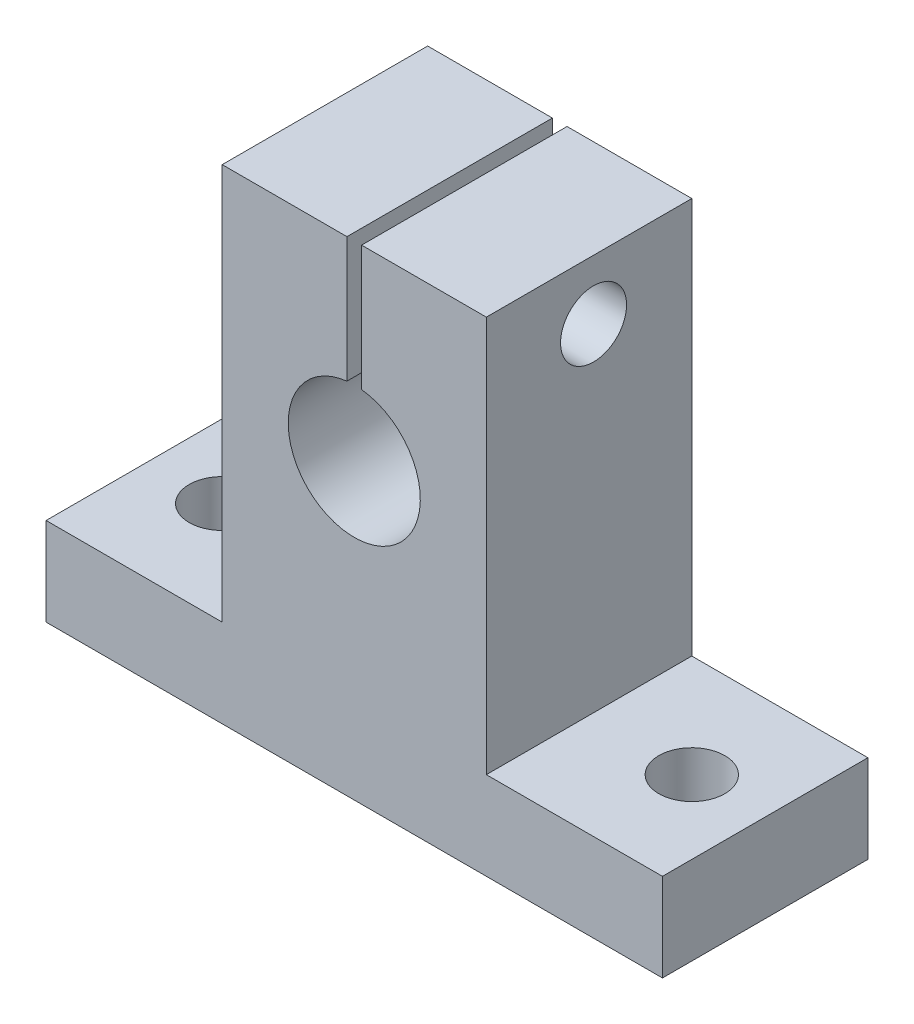
ISO-10303-21;
HEADER;
FILE_DESCRIPTION(('STEP AP214'),'2;1');
FILE_NAME('part.step','',(''),(''),'','','');
FILE_SCHEMA(('AUTOMOTIVE_DESIGN { 1 0 10303 214 1 1 1 1 }'));
ENDSEC;
DATA;
#1=APPLICATION_CONTEXT('core data for automotive mechanical design processes');
#2=APPLICATION_PROTOCOL_DEFINITION('international standard','automotive_design',2000,#1);
#3=PRODUCT_CONTEXT('',#1,'mechanical');
#4=PRODUCT('Part','Part','',(#3));
#5=PRODUCT_RELATED_PRODUCT_CATEGORY('part','',(#4));
#6=PRODUCT_DEFINITION_FORMATION('','',#4);
#7=PRODUCT_DEFINITION_CONTEXT('part definition',#1,'design');
#8=PRODUCT_DEFINITION('design','',#6,#7);
#9=PRODUCT_DEFINITION_SHAPE('','',#8);
#10=(LENGTH_UNIT() NAMED_UNIT(*) SI_UNIT(.MILLI.,.METRE.));
#11=(NAMED_UNIT(*) PLANE_ANGLE_UNIT() SI_UNIT($,.RADIAN.));
#12=(NAMED_UNIT(*) SI_UNIT($,.STERADIAN.) SOLID_ANGLE_UNIT());
#13=UNCERTAINTY_MEASURE_WITH_UNIT(LENGTH_MEASURE(1.E-05),#10,'distance_accuracy_value','');
#14=(GEOMETRIC_REPRESENTATION_CONTEXT(3) GLOBAL_UNCERTAINTY_ASSIGNED_CONTEXT((#13)) GLOBAL_UNIT_ASSIGNED_CONTEXT((#10,
#11,#12)) REPRESENTATION_CONTEXT('',''));
#15=CARTESIAN_POINT('',(0.,0.,0.));
#16=DIRECTION('',(0.,0.,1.));
#17=DIRECTION('',(1.,0.,0.));
#18=AXIS2_PLACEMENT_3D('',#15,#16,#17);
#19=CARTESIAN_POINT('',(0.,30.,14.));
#20=DIRECTION('',(0.,1.,0.));
#21=DIRECTION('',(0.,0.,1.));
#22=AXIS2_PLACEMENT_3D('',#19,#20,#21);
#23=PLANE('',#22);
#24=DIRECTION('',(0.,0.,1.));
#25=VECTOR('',#24,1.);
#26=CARTESIAN_POINT('',(0.5,30.,0.));
#27=LINE('',#26,#25);
#28=CARTESIAN_POINT('',(0.500000000000001,30.,0.));
#29=VERTEX_POINT('',#28);
#30=CARTESIAN_POINT('',(0.5,30.,14.));
#31=VERTEX_POINT('',#30);
#32=EDGE_CURVE('E59',#29,#31,#27,.T.);
#33=ORIENTED_EDGE('',*,*,#32,.T.);
#34=DIRECTION('',(1.,0.,0.));
#35=VECTOR('',#34,1.);
#36=CARTESIAN_POINT('',(0.,30.,14.));
#37=LINE('',#36,#35);
#38=CARTESIAN_POINT('',(9.,30.,14.));
#39=VERTEX_POINT('',#38);
#40=EDGE_CURVE('E299',#31,#39,#37,.T.);
#41=ORIENTED_EDGE('',*,*,#40,.T.);
#42=DIRECTION('',(0.,0.,-1.));
#43=VECTOR('',#42,1.);
#44=CARTESIAN_POINT('',(9.,30.,14.));
#45=LINE('',#44,#43);
#46=CARTESIAN_POINT('',(9.,30.,0.));
#47=VERTEX_POINT('',#46);
#48=EDGE_CURVE('E172',#39,#47,#45,.T.);
#49=ORIENTED_EDGE('',*,*,#48,.T.);
#50=DIRECTION('',(1.,0.,0.));
#51=VECTOR('',#50,1.);
#52=CARTESIAN_POINT('',(0.,30.,0.));
#53=LINE('',#52,#51);
#54=EDGE_CURVE('E158',#29,#47,#53,.T.);
#55=ORIENTED_EDGE('',*,*,#54,.F.);
#56=EDGE_LOOP('',(#33,#41,#49,#55));
#57=FACE_BOUND('',#56,.T.);
#58=ADVANCED_FACE('F42',(#57),#23,.T.);
#59=CARTESIAN_POINT('',(-9.,0.,14.));
#60=DIRECTION('',(-1.,0.,0.));
#61=DIRECTION('',(0.,0.,1.));
#62=AXIS2_PLACEMENT_3D('',#59,#60,#61);
#63=PLANE('',#62);
#64=CARTESIAN_POINT('',(-9.,25.95,6.69529201392618));
#65=DIRECTION('',(-1.,0.,0.));
#66=DIRECTION('',(0.,0.,1.));
#67=AXIS2_PLACEMENT_3D('',#64,#65,#66);
#68=CIRCLE('',#67,2.25);
#69=CARTESIAN_POINT('',(-9.,25.95,8.94529201392619));
#70=VERTEX_POINT('',#69);
#71=EDGE_CURVE('E338',#70,#70,#68,.F.);
#72=ORIENTED_EDGE('',*,*,#71,.T.);
#73=EDGE_LOOP('',(#72));
#74=FACE_BOUND('',#73,.T.);
#75=DIRECTION('',(0.,1.,0.));
#76=VECTOR('',#75,1.);
#77=CARTESIAN_POINT('',(-9.,0.,0.));
#78=LINE('',#77,#76);
#79=CARTESIAN_POINT('',(-9.,3.,0.));
#80=VERTEX_POINT('',#79);
#81=CARTESIAN_POINT('',(-9.,30.,0.));
#82=VERTEX_POINT('',#81);
#83=EDGE_CURVE('E155',#80,#82,#78,.T.);
#84=ORIENTED_EDGE('',*,*,#83,.F.);
#85=DIRECTION('',(0.,0.,-1.));
#86=VECTOR('',#85,1.);
#87=CARTESIAN_POINT('',(-9.,3.,14.));
#88=LINE('',#87,#86);
#89=CARTESIAN_POINT('',(-9.,3.,14.));
#90=VERTEX_POINT('',#89);
#91=EDGE_CURVE('E11',#90,#80,#88,.T.);
#92=ORIENTED_EDGE('',*,*,#91,.F.);
#93=DIRECTION('',(0.,1.,0.));
#94=VECTOR('',#93,1.);
#95=CARTESIAN_POINT('',(-9.,0.,14.));
#96=LINE('',#95,#94);
#97=CARTESIAN_POINT('',(-9.,30.,14.));
#98=VERTEX_POINT('',#97);
#99=EDGE_CURVE('E163',#90,#98,#96,.T.);
#100=ORIENTED_EDGE('',*,*,#99,.T.);
#101=DIRECTION('',(0.,0.,-1.));
#102=VECTOR('',#101,1.);
#103=CARTESIAN_POINT('',(-9.,30.,14.));
#104=LINE('',#103,#102);
#105=EDGE_CURVE('E169',#98,#82,#104,.T.);
#106=ORIENTED_EDGE('',*,*,#105,.T.);
#107=EDGE_LOOP('',(#84,#92,#100,#106));
#108=FACE_BOUND('',#107,.T.);
#109=ADVANCED_FACE('F263',(#74,#108),#63,.T.);
#110=CARTESIAN_POINT('',(0.,3.,14.));
#111=DIRECTION('',(0.,1.,0.));
#112=DIRECTION('',(0.,0.,1.));
#113=AXIS2_PLACEMENT_3D('',#110,#111,#112);
#114=PLANE('',#113);
#115=CARTESIAN_POINT('',(-16.,3.,7.));
#116=DIRECTION('',(0.,1.,0.));
#117=DIRECTION('',(0.,0.,1.));
#118=AXIS2_PLACEMENT_3D('',#115,#116,#117);
#119=CIRCLE('',#118,2.25);
#120=CARTESIAN_POINT('',(-16.,3.,9.25));
#121=VERTEX_POINT('',#120);
#122=EDGE_CURVE('E312',#121,#121,#119,.T.);
#123=ORIENTED_EDGE('',*,*,#122,.F.);
#124=EDGE_LOOP('',(#123));
#125=FACE_BOUND('',#124,.T.);
#126=DIRECTION('',(1.,0.,0.));
#127=VECTOR('',#126,1.);
#128=CARTESIAN_POINT('',(0.,3.,0.));
#129=LINE('',#128,#127);
#130=CARTESIAN_POINT('',(-21.,3.,0.));
#131=VERTEX_POINT('',#130);
#132=EDGE_CURVE('E202',#131,#80,#129,.T.);
#133=ORIENTED_EDGE('',*,*,#132,.F.);
#134=DIRECTION('',(0.,0.,-1.));
#135=VECTOR('',#134,1.);
#136=CARTESIAN_POINT('',(-21.,3.,14.));
#137=LINE('',#136,#135);
#138=CARTESIAN_POINT('',(-21.,3.,14.));
#139=VERTEX_POINT('',#138);
#140=EDGE_CURVE('E52',#139,#131,#137,.T.);
#141=ORIENTED_EDGE('',*,*,#140,.F.);
#142=DIRECTION('',(1.,0.,0.));
#143=VECTOR('',#142,1.);
#144=CARTESIAN_POINT('',(0.,3.,14.));
#145=LINE('',#144,#143);
#146=EDGE_CURVE('E306',#139,#90,#145,.T.);
#147=ORIENTED_EDGE('',*,*,#146,.T.);
#148=ORIENTED_EDGE('',*,*,#91,.T.);
#149=EDGE_LOOP('',(#133,#141,#147,#148));
#150=FACE_BOUND('',#149,.T.);
#151=ADVANCED_FACE('F203',(#125,#150),#114,.T.);
#152=CARTESIAN_POINT('',(-21.,0.,14.));
#153=DIRECTION('',(-1.,0.,0.));
#154=DIRECTION('',(0.,0.,1.));
#155=AXIS2_PLACEMENT_3D('',#152,#153,#154);
#156=PLANE('',#155);
#157=DIRECTION('',(0.,1.,0.));
#158=VECTOR('',#157,1.);
#159=CARTESIAN_POINT('',(-21.,0.,0.));
#160=LINE('',#159,#158);
#161=CARTESIAN_POINT('',(-21.,-3.,0.));
#162=VERTEX_POINT('',#161);
#163=EDGE_CURVE('E196',#162,#131,#160,.T.);
#164=ORIENTED_EDGE('',*,*,#163,.F.);
#165=DIRECTION('',(0.,0.,-1.));
#166=VECTOR('',#165,1.);
#167=CARTESIAN_POINT('',(-21.,-3.,14.));
#168=LINE('',#167,#166);
#169=CARTESIAN_POINT('',(-21.,-3.,14.));
#170=VERTEX_POINT('',#169);
#171=EDGE_CURVE('E186',#170,#162,#168,.T.);
#172=ORIENTED_EDGE('',*,*,#171,.F.);
#173=DIRECTION('',(0.,1.,0.));
#174=VECTOR('',#173,1.);
#175=CARTESIAN_POINT('',(-21.,0.,14.));
#176=LINE('',#175,#174);
#177=EDGE_CURVE('E198',#170,#139,#176,.T.);
#178=ORIENTED_EDGE('',*,*,#177,.T.);
#179=ORIENTED_EDGE('',*,*,#140,.T.);
#180=EDGE_LOOP('',(#164,#172,#178,#179));
#181=FACE_BOUND('',#180,.T.);
#182=ADVANCED_FACE('F194',(#181),#156,.T.);
#183=CARTESIAN_POINT('',(0.,-3.,14.));
#184=DIRECTION('',(0.,1.,0.));
#185=DIRECTION('',(0.,0.,1.));
#186=AXIS2_PLACEMENT_3D('',#183,#184,#185);
#187=PLANE('',#186);
#188=CARTESIAN_POINT('',(16.,-3.,7.));
#189=DIRECTION('',(0.,1.,0.));
#190=DIRECTION('',(0.,0.,-1.));
#191=AXIS2_PLACEMENT_3D('',#188,#189,#190);
#192=CIRCLE('',#191,2.25);
#193=CARTESIAN_POINT('',(16.,-3.,4.75));
#194=VERTEX_POINT('',#193);
#195=EDGE_CURVE('E290',#194,#194,#192,.T.);
#196=ORIENTED_EDGE('',*,*,#195,.T.);
#197=EDGE_LOOP('',(#196));
#198=FACE_BOUND('',#197,.T.);
#199=CARTESIAN_POINT('',(-16.,-3.,7.));
#200=DIRECTION('',(0.,1.,0.));
#201=DIRECTION('',(0.,0.,1.));
#202=AXIS2_PLACEMENT_3D('',#199,#200,#201);
#203=CIRCLE('',#202,2.25);
#204=CARTESIAN_POINT('',(-16.,-3.,9.25));
#205=VERTEX_POINT('',#204);
#206=EDGE_CURVE('E316',#205,#205,#203,.T.);
#207=ORIENTED_EDGE('',*,*,#206,.T.);
#208=EDGE_LOOP('',(#207));
#209=FACE_BOUND('',#208,.T.);
#210=DIRECTION('',(1.,0.,0.));
#211=VECTOR('',#210,1.);
#212=CARTESIAN_POINT('',(0.,-3.,0.));
#213=LINE('',#212,#211);
#214=CARTESIAN_POINT('',(21.,-3.,0.));
#215=VERTEX_POINT('',#214);
#216=EDGE_CURVE('E209',#162,#215,#213,.T.);
#217=ORIENTED_EDGE('',*,*,#216,.T.);
#218=DIRECTION('',(0.,0.,-1.));
#219=VECTOR('',#218,1.);
#220=CARTESIAN_POINT('',(21.,-3.,14.));
#221=LINE('',#220,#219);
#222=CARTESIAN_POINT('',(21.,-3.,14.));
#223=VERTEX_POINT('',#222);
#224=EDGE_CURVE('E182',#223,#215,#221,.T.);
#225=ORIENTED_EDGE('',*,*,#224,.F.);
#226=DIRECTION('',(1.,0.,0.));
#227=VECTOR('',#226,1.);
#228=CARTESIAN_POINT('',(0.,-3.,14.));
#229=LINE('',#228,#227);
#230=EDGE_CURVE('E242',#170,#223,#229,.T.);
#231=ORIENTED_EDGE('',*,*,#230,.F.);
#232=ORIENTED_EDGE('',*,*,#171,.T.);
#233=EDGE_LOOP('',(#217,#225,#231,#232));
#234=FACE_BOUND('',#233,.T.);
#235=ADVANCED_FACE('F250',(#198,#209,#234),#187,.F.);
#236=CARTESIAN_POINT('',(21.,0.,14.));
#237=DIRECTION('',(-1.,0.,0.));
#238=DIRECTION('',(0.,0.,1.));
#239=AXIS2_PLACEMENT_3D('',#236,#237,#238);
#240=PLANE('',#239);
#241=DIRECTION('',(0.,1.,0.));
#242=VECTOR('',#241,1.);
#243=CARTESIAN_POINT('',(21.,0.,0.));
#244=LINE('',#243,#242);
#245=CARTESIAN_POINT('',(21.,3.,0.));
#246=VERTEX_POINT('',#245);
#247=EDGE_CURVE('E213',#215,#246,#244,.T.);
#248=ORIENTED_EDGE('',*,*,#247,.T.);
#249=DIRECTION('',(0.,0.,-1.));
#250=VECTOR('',#249,1.);
#251=CARTESIAN_POINT('',(21.,3.,14.));
#252=LINE('',#251,#250);
#253=CARTESIAN_POINT('',(21.,3.,14.));
#254=VERTEX_POINT('',#253);
#255=EDGE_CURVE('E179',#254,#246,#252,.T.);
#256=ORIENTED_EDGE('',*,*,#255,.F.);
#257=DIRECTION('',(0.,1.,0.));
#258=VECTOR('',#257,1.);
#259=CARTESIAN_POINT('',(21.,0.,14.));
#260=LINE('',#259,#258);
#261=EDGE_CURVE('E237',#223,#254,#260,.T.);
#262=ORIENTED_EDGE('',*,*,#261,.F.);
#263=ORIENTED_EDGE('',*,*,#224,.T.);
#264=EDGE_LOOP('',(#248,#256,#262,#263));
#265=FACE_BOUND('',#264,.T.);
#266=ADVANCED_FACE('F236',(#265),#240,.F.);
#267=CARTESIAN_POINT('',(16.,3.,7.));
#268=DIRECTION('',(0.,1.,0.));
#269=DIRECTION('',(0.,0.,-1.));
#270=AXIS2_PLACEMENT_3D('',#267,#268,#269);
#271=CIRCLE('',#270,2.25);
#272=CARTESIAN_POINT('',(16.,3.,4.75));
#273=VERTEX_POINT('',#272);
#274=EDGE_CURVE('E294',#273,#273,#271,.T.);
#275=ORIENTED_EDGE('',*,*,#274,.F.);
#276=EDGE_LOOP('',(#275));
#277=FACE_BOUND('',#276,.T.);
#278=CARTESIAN_POINT('',(9.,3.,0.));
#279=VERTEX_POINT('',#278);
#280=EDGE_CURVE('E206',#279,#246,#129,.T.);
#281=ORIENTED_EDGE('',*,*,#280,.F.);
#282=DIRECTION('',(0.,0.,-1.));
#283=VECTOR('',#282,1.);
#284=CARTESIAN_POINT('',(9.,3.,14.));
#285=LINE('',#284,#283);
#286=CARTESIAN_POINT('',(9.,3.,14.));
#287=VERTEX_POINT('',#286);
#288=EDGE_CURVE('E176',#287,#279,#285,.T.);
#289=ORIENTED_EDGE('',*,*,#288,.F.);
#290=EDGE_CURVE('E235',#287,#254,#145,.T.);
#291=ORIENTED_EDGE('',*,*,#290,.T.);
#292=ORIENTED_EDGE('',*,*,#255,.T.);
#293=EDGE_LOOP('',(#281,#289,#291,#292));
#294=FACE_BOUND('',#293,.T.);
#295=ADVANCED_FACE('F232',(#277,#294),#114,.T.);
#296=CARTESIAN_POINT('',(9.,0.,14.));
#297=DIRECTION('',(-1.,0.,0.));
#298=DIRECTION('',(0.,0.,1.));
#299=AXIS2_PLACEMENT_3D('',#296,#297,#298);
#300=PLANE('',#299);
#301=CARTESIAN_POINT('',(9.,25.95,6.69529201392618));
#302=DIRECTION('',(1.,0.,0.));
#303=DIRECTION('',(0.,0.,-1.));
#304=AXIS2_PLACEMENT_3D('',#301,#302,#303);
#305=CIRCLE('',#304,2.25);
#306=CARTESIAN_POINT('',(9.,25.95,4.44529201392618));
#307=VERTEX_POINT('',#306);
#308=EDGE_CURVE('E342',#307,#307,#305,.T.);
#309=ORIENTED_EDGE('',*,*,#308,.F.);
#310=EDGE_LOOP('',(#309));
#311=FACE_BOUND('',#310,.T.);
#312=DIRECTION('',(0.,1.,0.));
#313=VECTOR('',#312,1.);
#314=CARTESIAN_POINT('',(9.,0.,0.));
#315=LINE('',#314,#313);
#316=EDGE_CURVE('E165',#279,#47,#315,.T.);
#317=ORIENTED_EDGE('',*,*,#316,.T.);
#318=ORIENTED_EDGE('',*,*,#48,.F.);
#319=DIRECTION('',(0.,1.,0.));
#320=VECTOR('',#319,1.);
#321=CARTESIAN_POINT('',(9.,0.,14.));
#322=LINE('',#321,#320);
#323=EDGE_CURVE('E300',#287,#39,#322,.T.);
#324=ORIENTED_EDGE('',*,*,#323,.F.);
#325=ORIENTED_EDGE('',*,*,#288,.T.);
#326=EDGE_LOOP('',(#317,#318,#324,#325));
#327=FACE_BOUND('',#326,.T.);
#328=ADVANCED_FACE('F228',(#311,#327),#300,.F.);
#329=CARTESIAN_POINT('',(0.,17.,14.));
#330=DIRECTION('',(0.,0.,-1.));
#331=DIRECTION('',(-1.,0.,0.));
#332=AXIS2_PLACEMENT_3D('',#329,#330,#331);
#333=CYLINDRICAL_SURFACE('',#332,4.5);
#334=DIRECTION('',(0.,0.,1.));
#335=VECTOR('',#334,1.);
#336=CARTESIAN_POINT('',(0.500000000000001,21.4721359549996,0.));
#337=LINE('',#336,#335);
#338=CARTESIAN_POINT('',(0.500000000000001,21.4721359549996,0.));
#339=VERTEX_POINT('',#338);
#340=CARTESIAN_POINT('',(0.500000000000001,21.4721359549996,14.));
#341=VERTEX_POINT('',#340);
#342=EDGE_CURVE('E284',#339,#341,#337,.T.);
#343=ORIENTED_EDGE('',*,*,#342,.F.);
#344=CARTESIAN_POINT('',(0.,17.,0.));
#345=DIRECTION('',(0.,0.,1.));
#346=DIRECTION('',(1.,0.,0.));
#347=AXIS2_PLACEMENT_3D('',#344,#345,#346);
#348=CIRCLE('',#347,4.5);
#349=CARTESIAN_POINT('',(-0.500000000000005,21.4721359549996,0.));
#350=VERTEX_POINT('',#349);
#351=EDGE_CURVE('E285',#350,#339,#348,.T.);
#352=ORIENTED_EDGE('',*,*,#351,.F.);
#353=DIRECTION('',(0.,0.,1.));
#354=VECTOR('',#353,1.);
#355=CARTESIAN_POINT('',(-0.500000000000005,21.4721359549996,0.));
#356=LINE('',#355,#354);
#357=CARTESIAN_POINT('',(-0.500000000000005,21.4721359549996,14.));
#358=VERTEX_POINT('',#357);
#359=EDGE_CURVE('E67',#350,#358,#356,.T.);
#360=ORIENTED_EDGE('',*,*,#359,.T.);
#361=CARTESIAN_POINT('',(0.,17.,14.));
#362=DIRECTION('',(0.,0.,1.));
#363=DIRECTION('',(1.,0.,0.));
#364=AXIS2_PLACEMENT_3D('',#361,#362,#363);
#365=CIRCLE('',#364,4.5);
#366=EDGE_CURVE('E157',#358,#341,#365,.T.);
#367=ORIENTED_EDGE('',*,*,#366,.T.);
#368=EDGE_LOOP('',(#343,#352,#360,#367));
#369=FACE_BOUND('',#368,.T.);
#370=ADVANCED_FACE('F44',(#369),#333,.F.);
#371=DIRECTION('',(0.,0.,1.));
#372=VECTOR('',#371,1.);
#373=CARTESIAN_POINT('',(-0.5,30.,0.));
#374=LINE('',#373,#372);
#375=CARTESIAN_POINT('',(-0.5,30.,0.));
#376=VERTEX_POINT('',#375);
#377=CARTESIAN_POINT('',(-0.5,30.,14.));
#378=VERTEX_POINT('',#377);
#379=EDGE_CURVE('E132',#376,#378,#374,.T.);
#380=ORIENTED_EDGE('',*,*,#379,.F.);
#381=EDGE_CURVE('E146',#82,#376,#53,.T.);
#382=ORIENTED_EDGE('',*,*,#381,.F.);
#383=ORIENTED_EDGE('',*,*,#105,.F.);
#384=EDGE_CURVE('E148',#98,#378,#37,.T.);
#385=ORIENTED_EDGE('',*,*,#384,.T.);
#386=EDGE_LOOP('',(#380,#382,#383,#385));
#387=FACE_BOUND('',#386,.T.);
#388=ADVANCED_FACE('F145',(#387),#23,.T.);
#389=CARTESIAN_POINT('',(0.,0.,14.));
#390=DIRECTION('',(0.,0.,1.));
#391=DIRECTION('',(1.,0.,0.));
#392=AXIS2_PLACEMENT_3D('',#389,#390,#391);
#393=PLANE('',#392);
#394=DIRECTION('',(0.,1.,0.));
#395=VECTOR('',#394,1.);
#396=CARTESIAN_POINT('',(0.5,30.,14.));
#397=LINE('',#396,#395);
#398=EDGE_CURVE('E140',#341,#31,#397,.T.);
#399=ORIENTED_EDGE('',*,*,#398,.F.);
#400=ORIENTED_EDGE('',*,*,#366,.F.);
#401=DIRECTION('',(0.,-1.,0.));
#402=VECTOR('',#401,1.);
#403=CARTESIAN_POINT('',(-0.5,30.,14.));
#404=LINE('',#403,#402);
#405=EDGE_CURVE('E329',#378,#358,#404,.T.);
#406=ORIENTED_EDGE('',*,*,#405,.F.);
#407=ORIENTED_EDGE('',*,*,#384,.F.);
#408=ORIENTED_EDGE('',*,*,#99,.F.);
#409=ORIENTED_EDGE('',*,*,#146,.F.);
#410=ORIENTED_EDGE('',*,*,#177,.F.);
#411=ORIENTED_EDGE('',*,*,#230,.T.);
#412=ORIENTED_EDGE('',*,*,#261,.T.);
#413=ORIENTED_EDGE('',*,*,#290,.F.);
#414=ORIENTED_EDGE('',*,*,#323,.T.);
#415=ORIENTED_EDGE('',*,*,#40,.F.);
#416=EDGE_LOOP('',(#399,#400,#406,#407,#408,#409,#410,#411,#412,#413,#414,#415));
#417=FACE_BOUND('',#416,.T.);
#418=ADVANCED_FACE('F246',(#417),#393,.T.);
#419=CARTESIAN_POINT('',(0.,0.,0.));
#420=DIRECTION('',(0.,0.,1.));
#421=DIRECTION('',(1.,0.,0.));
#422=AXIS2_PLACEMENT_3D('',#419,#420,#421);
#423=PLANE('',#422);
#424=ORIENTED_EDGE('',*,*,#351,.T.);
#425=DIRECTION('',(0.,1.,0.));
#426=VECTOR('',#425,1.);
#427=CARTESIAN_POINT('',(0.5,30.,0.));
#428=LINE('',#427,#426);
#429=EDGE_CURVE('E139',#339,#29,#428,.T.);
#430=ORIENTED_EDGE('',*,*,#429,.T.);
#431=ORIENTED_EDGE('',*,*,#54,.T.);
#432=ORIENTED_EDGE('',*,*,#316,.F.);
#433=ORIENTED_EDGE('',*,*,#280,.T.);
#434=ORIENTED_EDGE('',*,*,#247,.F.);
#435=ORIENTED_EDGE('',*,*,#216,.F.);
#436=ORIENTED_EDGE('',*,*,#163,.T.);
#437=ORIENTED_EDGE('',*,*,#132,.T.);
#438=ORIENTED_EDGE('',*,*,#83,.T.);
#439=ORIENTED_EDGE('',*,*,#381,.T.);
#440=DIRECTION('',(0.,-1.,0.));
#441=VECTOR('',#440,1.);
#442=CARTESIAN_POINT('',(-0.5,30.,0.));
#443=LINE('',#442,#441);
#444=EDGE_CURVE('E129',#376,#350,#443,.T.);
#445=ORIENTED_EDGE('',*,*,#444,.T.);
#446=EDGE_LOOP('',(#424,#430,#431,#432,#433,#434,#435,#436,#437,#438,#439,#445));
#447=FACE_BOUND('',#446,.T.);
#448=ADVANCED_FACE('F152',(#447),#423,.F.);
#449=CARTESIAN_POINT('',(16.,-3.,7.));
#450=DIRECTION('',(0.,1.,0.));
#451=DIRECTION('',(0.,0.,1.));
#452=AXIS2_PLACEMENT_3D('',#449,#450,#451);
#453=CYLINDRICAL_SURFACE('',#452,2.25);
#454=ORIENTED_EDGE('',*,*,#195,.F.);
#455=EDGE_LOOP('',(#454));
#456=FACE_BOUND('',#455,.T.);
#457=ORIENTED_EDGE('',*,*,#274,.T.);
#458=EDGE_LOOP('',(#457));
#459=FACE_BOUND('',#458,.T.);
#460=ADVANCED_FACE('F371',(#456,#459),#453,.F.);
#461=CARTESIAN_POINT('',(-16.,-3.,7.));
#462=DIRECTION('',(0.,1.,0.));
#463=DIRECTION('',(0.,0.,1.));
#464=AXIS2_PLACEMENT_3D('',#461,#462,#463);
#465=CYLINDRICAL_SURFACE('',#464,2.25);
#466=ORIENTED_EDGE('',*,*,#206,.F.);
#467=EDGE_LOOP('',(#466));
#468=FACE_BOUND('',#467,.T.);
#469=ORIENTED_EDGE('',*,*,#122,.T.);
#470=EDGE_LOOP('',(#469));
#471=FACE_BOUND('',#470,.T.);
#472=ADVANCED_FACE('F367',(#468,#471),#465,.F.);
#473=CARTESIAN_POINT('',(-0.5,30.,0.));
#474=DIRECTION('',(-1.,0.,0.));
#475=DIRECTION('',(0.,-1.,0.));
#476=AXIS2_PLACEMENT_3D('',#473,#474,#475);
#477=PLANE('',#476);
#478=CARTESIAN_POINT('',(-0.500000000000002,25.95,6.69529201392618));
#479=DIRECTION('',(-1.,0.,0.));
#480=DIRECTION('',(0.,-1.,0.));
#481=AXIS2_PLACEMENT_3D('',#478,#479,#480);
#482=CIRCLE('',#481,2.25);
#483=CARTESIAN_POINT('',(-0.500000000000003,23.7,6.69529201392618));
#484=VERTEX_POINT('',#483);
#485=EDGE_CURVE('E332',#484,#484,#482,.T.);
#486=ORIENTED_EDGE('',*,*,#485,.T.);
#487=EDGE_LOOP('',(#486));
#488=FACE_BOUND('',#487,.T.);
#489=ORIENTED_EDGE('',*,*,#405,.T.);
#490=ORIENTED_EDGE('',*,*,#359,.F.);
#491=ORIENTED_EDGE('',*,*,#444,.F.);
#492=ORIENTED_EDGE('',*,*,#379,.T.);
#493=EDGE_LOOP('',(#489,#490,#491,#492));
#494=FACE_BOUND('',#493,.T.);
#495=ADVANCED_FACE('F131',(#488,#494),#477,.F.);
#496=CARTESIAN_POINT('',(0.5,30.,0.));
#497=DIRECTION('',(1.,0.,0.));
#498=DIRECTION('',(0.,1.,0.));
#499=AXIS2_PLACEMENT_3D('',#496,#497,#498);
#500=PLANE('',#499);
#501=CARTESIAN_POINT('',(0.499999999999999,25.95,6.69529201392618));
#502=DIRECTION('',(1.,0.,0.));
#503=DIRECTION('',(0.,1.,0.));
#504=AXIS2_PLACEMENT_3D('',#501,#502,#503);
#505=CIRCLE('',#504,2.25);
#506=CARTESIAN_POINT('',(0.499999999999998,28.2,6.69529201392618));
#507=VERTEX_POINT('',#506);
#508=EDGE_CURVE('E46',#507,#507,#505,.T.);
#509=ORIENTED_EDGE('',*,*,#508,.T.);
#510=EDGE_LOOP('',(#509));
#511=FACE_BOUND('',#510,.T.);
#512=ORIENTED_EDGE('',*,*,#398,.T.);
#513=ORIENTED_EDGE('',*,*,#32,.F.);
#514=ORIENTED_EDGE('',*,*,#429,.F.);
#515=ORIENTED_EDGE('',*,*,#342,.T.);
#516=EDGE_LOOP('',(#512,#513,#514,#515));
#517=FACE_BOUND('',#516,.T.);
#518=ADVANCED_FACE('F351',(#511,#517),#500,.F.);
#519=CARTESIAN_POINT('',(-15.3639610306789,25.95,6.69529201392618));
#520=DIRECTION('',(1.,0.,0.));
#521=DIRECTION('',(0.,0.,-1.));
#522=AXIS2_PLACEMENT_3D('',#519,#520,#521);
#523=CYLINDRICAL_SURFACE('',#522,2.25);
#524=ORIENTED_EDGE('',*,*,#308,.T.);
#525=EDGE_LOOP('',(#524));
#526=FACE_BOUND('',#525,.T.);
#527=ORIENTED_EDGE('',*,*,#508,.F.);
#528=EDGE_LOOP('',(#527));
#529=FACE_BOUND('',#528,.T.);
#530=ADVANCED_FACE('F347',(#526,#529),#523,.F.);
#531=ORIENTED_EDGE('',*,*,#71,.F.);
#532=EDGE_LOOP('',(#531));
#533=FACE_BOUND('',#532,.T.);
#534=ORIENTED_EDGE('',*,*,#485,.F.);
#535=EDGE_LOOP('',(#534));
#536=FACE_BOUND('',#535,.T.);
#537=ADVANCED_FACE('F350',(#533,#536),#523,.F.);
#538=CLOSED_SHELL('',(#58,#109,#151,#182,#235,#266,#295,#328,#370,#388,#418,#448,#460,#472,#495,
#518,#530,#537));
#539=MANIFOLD_SOLID_BREP('B2',#538);
#540=ADVANCED_BREP_SHAPE_REPRESENTATION('',(#18,#539),#14);
#541=SHAPE_DEFINITION_REPRESENTATION(#9,#540);
ENDSEC;
END-ISO-10303-21;
